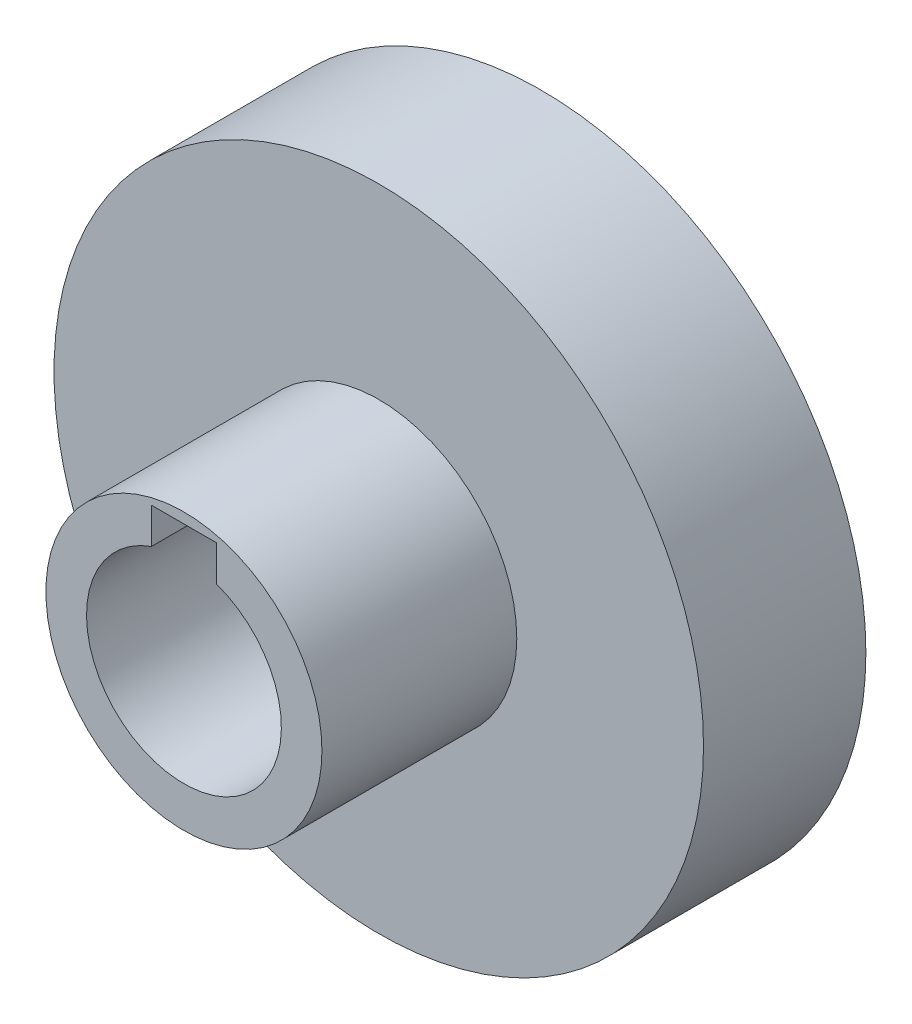
ISO-10303-21;
HEADER;
FILE_DESCRIPTION(('STEP AP214'),'2;1');
FILE_NAME('part.step','',(''),(''),'','','');
FILE_SCHEMA(('AUTOMOTIVE_DESIGN { 1 0 10303 214 1 1 1 1 }'));
ENDSEC;
DATA;
#1=APPLICATION_CONTEXT('core data for automotive mechanical design processes');
#2=APPLICATION_PROTOCOL_DEFINITION('international standard','automotive_design',2000,#1);
#3=PRODUCT_CONTEXT('',#1,'mechanical');
#4=PRODUCT('Part','Part','',(#3));
#5=PRODUCT_RELATED_PRODUCT_CATEGORY('part','',(#4));
#6=PRODUCT_DEFINITION_FORMATION('','',#4);
#7=PRODUCT_DEFINITION_CONTEXT('part definition',#1,'design');
#8=PRODUCT_DEFINITION('design','',#6,#7);
#9=PRODUCT_DEFINITION_SHAPE('','',#8);
#10=(LENGTH_UNIT() NAMED_UNIT(*) SI_UNIT(.MILLI.,.METRE.));
#11=(NAMED_UNIT(*) PLANE_ANGLE_UNIT() SI_UNIT($,.RADIAN.));
#12=(NAMED_UNIT(*) SI_UNIT($,.STERADIAN.) SOLID_ANGLE_UNIT());
#13=UNCERTAINTY_MEASURE_WITH_UNIT(LENGTH_MEASURE(1.E-05),#10,'distance_accuracy_value','');
#14=(GEOMETRIC_REPRESENTATION_CONTEXT(3) GLOBAL_UNCERTAINTY_ASSIGNED_CONTEXT((#13)) GLOBAL_UNIT_ASSIGNED_CONTEXT((#10,
#11,#12)) REPRESENTATION_CONTEXT('',''));
#15=CARTESIAN_POINT('',(0.,0.,0.));
#16=DIRECTION('',(0.,0.,1.));
#17=DIRECTION('',(1.,0.,0.));
#18=AXIS2_PLACEMENT_3D('',#15,#16,#17);
#19=CARTESIAN_POINT('',(10.,0.,5.));
#20=DIRECTION('',(0.,0.,1.));
#21=DIRECTION('',(1.,0.,0.));
#22=AXIS2_PLACEMENT_3D('',#19,#20,#21);
#23=PLANE('',#22);
#24=CARTESIAN_POINT('',(0.,0.,5.));
#25=DIRECTION('',(0.,0.,1.));
#26=DIRECTION('',(1.,0.,0.));
#27=AXIS2_PLACEMENT_3D('',#24,#25,#26);
#28=CIRCLE('',#27,10.);
#29=CARTESIAN_POINT('',(10.,0.,5.));
#30=VERTEX_POINT('',#29);
#31=EDGE_CURVE('E58',#30,#30,#28,.T.);
#32=ORIENTED_EDGE('',*,*,#31,.T.);
#33=EDGE_LOOP('',(#32));
#34=FACE_BOUND('',#33,.T.);
#35=ADVANCED_FACE('F55',(#34),#23,.T.);
#36=CARTESIAN_POINT('',(0.,0.,0.));
#37=DIRECTION('',(0.,0.,1.));
#38=DIRECTION('',(1.,0.,0.));
#39=AXIS2_PLACEMENT_3D('',#36,#37,#38);
#40=PLANE('',#39);
#41=CARTESIAN_POINT('',(0.,0.,0.));
#42=DIRECTION('',(0.,0.,1.));
#43=DIRECTION('',(1.,0.,0.));
#44=AXIS2_PLACEMENT_3D('',#41,#42,#43);
#45=CIRCLE('',#44,10.);
#46=CARTESIAN_POINT('',(10.,0.,0.));
#47=VERTEX_POINT('',#46);
#48=EDGE_CURVE('E11',#47,#47,#45,.T.);
#49=ORIENTED_EDGE('',*,*,#48,.F.);
#50=EDGE_LOOP('',(#49));
#51=FACE_BOUND('',#50,.T.);
#52=ADVANCED_FACE('F72',(#51),#40,.F.);
#53=CARTESIAN_POINT('',(0.,0.,5.));
#54=DIRECTION('',(0.,0.,-1.));
#55=DIRECTION('',(-1.,0.,0.));
#56=AXIS2_PLACEMENT_3D('',#53,#54,#55);
#57=CYLINDRICAL_SURFACE('',#56,10.);
#58=ORIENTED_EDGE('',*,*,#31,.F.);
#59=EDGE_LOOP('',(#58));
#60=FACE_BOUND('',#59,.T.);
#61=ORIENTED_EDGE('',*,*,#48,.T.);
#62=EDGE_LOOP('',(#61));
#63=FACE_BOUND('',#62,.T.);
#64=ADVANCED_FACE('F70',(#60,#63),#57,.T.);
#65=CLOSED_SHELL('',(#35,#52,#64));
#66=MANIFOLD_SOLID_BREP('B2',#65);
#67=CARTESIAN_POINT('',(10.,0.,5.));
#68=DIRECTION('',(0.,0.,1.));
#69=DIRECTION('',(1.,0.,0.));
#70=AXIS2_PLACEMENT_3D('',#67,#68,#69);
#71=PLANE('',#70);
#72=CARTESIAN_POINT('',(0.,0.,5.));
#73=DIRECTION('',(0.,0.,1.));
#74=DIRECTION('',(1.,0.,0.));
#75=AXIS2_PLACEMENT_3D('',#72,#73,#74);
#76=CIRCLE('',#75,4.25);
#77=CARTESIAN_POINT('',(4.25,0.,5.));
#78=VERTEX_POINT('',#77);
#79=EDGE_CURVE('E107',#78,#78,#76,.T.);
#80=ORIENTED_EDGE('',*,*,#79,.F.);
#81=EDGE_LOOP('',(#80));
#82=FACE_BOUND('',#81,.T.);
#83=CARTESIAN_POINT('',(0.,0.,5.));
#84=DIRECTION('',(0.,0.,1.));
#85=DIRECTION('',(1.,0.,0.));
#86=AXIS2_PLACEMENT_3D('',#83,#84,#85);
#87=CIRCLE('',#86,3.);
#88=CARTESIAN_POINT('',(1.,2.82842712474619,5.));
#89=VERTEX_POINT('',#88);
#90=CARTESIAN_POINT('',(-1.,2.82842712474619,5.));
#91=VERTEX_POINT('',#90);
#92=EDGE_CURVE('E175',#89,#91,#87,.F.);
#93=ORIENTED_EDGE('',*,*,#92,.F.);
#94=DIRECTION('',(0.,1.,0.));
#95=VECTOR('',#94,1.);
#96=CARTESIAN_POINT('',(0.999999999999999,3.92842712474619,5.));
#97=LINE('',#96,#95);
#98=CARTESIAN_POINT('',(0.999999999999999,3.92842712474619,5.));
#99=VERTEX_POINT('',#98);
#100=EDGE_CURVE('E53',#89,#99,#97,.T.);
#101=ORIENTED_EDGE('',*,*,#100,.T.);
#102=DIRECTION('',(-1.,0.,0.));
#103=VECTOR('',#102,1.);
#104=CARTESIAN_POINT('',(-1.,3.92842712474619,5.));
#105=LINE('',#104,#103);
#106=CARTESIAN_POINT('',(-1.,3.92842712474619,5.));
#107=VERTEX_POINT('',#106);
#108=EDGE_CURVE('E112',#99,#107,#105,.T.);
#109=ORIENTED_EDGE('',*,*,#108,.T.);
#110=DIRECTION('',(0.,1.,0.));
#111=VECTOR('',#110,1.);
#112=CARTESIAN_POINT('',(-1.,3.92842712474619,5.));
#113=LINE('',#112,#111);
#114=EDGE_CURVE('E126',#91,#107,#113,.T.);
#115=ORIENTED_EDGE('',*,*,#114,.F.);
#116=EDGE_LOOP('',(#93,#101,#109,#115));
#117=FACE_BOUND('',#116,.T.);
#118=ADVANCED_FACE('F104',(#82,#117),#71,.F.);
#119=CARTESIAN_POINT('',(0.,0.,-4.16532063939494));
#120=DIRECTION('',(0.,0.,1.));
#121=DIRECTION('',(1.,0.,0.));
#122=AXIS2_PLACEMENT_3D('',#119,#120,#121);
#123=CYLINDRICAL_SURFACE('',#122,3.);
#124=ORIENTED_EDGE('',*,*,#92,.T.);
#125=DIRECTION('',(0.,0.,1.));
#126=VECTOR('',#125,1.);
#127=CARTESIAN_POINT('',(-1.,2.82842712474619,-4.16532063939494));
#128=LINE('',#127,#126);
#129=CARTESIAN_POINT('',(-1.,2.82842712474619,11.));
#130=VERTEX_POINT('',#129);
#131=EDGE_CURVE('E153',#91,#130,#128,.T.);
#132=ORIENTED_EDGE('',*,*,#131,.T.);
#133=CARTESIAN_POINT('',(0.,0.,11.));
#134=DIRECTION('',(0.,0.,1.));
#135=DIRECTION('',(1.,0.,0.));
#136=AXIS2_PLACEMENT_3D('',#133,#134,#135);
#137=CIRCLE('',#136,3.);
#138=CARTESIAN_POINT('',(1.,2.82842712474619,11.));
#139=VERTEX_POINT('',#138);
#140=EDGE_CURVE('E157',#130,#139,#137,.T.);
#141=ORIENTED_EDGE('',*,*,#140,.T.);
#142=DIRECTION('',(0.,0.,1.));
#143=VECTOR('',#142,1.);
#144=CARTESIAN_POINT('',(1.,2.82842712474619,-4.16532063939494));
#145=LINE('',#144,#143);
#146=EDGE_CURVE('E144',#89,#139,#145,.T.);
#147=ORIENTED_EDGE('',*,*,#146,.F.);
#148=EDGE_LOOP('',(#124,#132,#141,#147));
#149=FACE_BOUND('',#148,.T.);
#150=ADVANCED_FACE('F158',(#149),#123,.F.);
#151=CARTESIAN_POINT('',(-1.,3.92842712474619,-4.16532063939494));
#152=DIRECTION('',(-1.,0.,0.));
#153=DIRECTION('',(0.,-1.,0.));
#154=AXIS2_PLACEMENT_3D('',#151,#152,#153);
#155=PLANE('',#154);
#156=ORIENTED_EDGE('',*,*,#114,.T.);
#157=DIRECTION('',(0.,0.,1.));
#158=VECTOR('',#157,1.);
#159=CARTESIAN_POINT('',(-1.,3.92842712474619,-4.16532063939494));
#160=LINE('',#159,#158);
#161=CARTESIAN_POINT('',(-1.,3.92842712474619,11.));
#162=VERTEX_POINT('',#161);
#163=EDGE_CURVE('E171',#107,#162,#160,.T.);
#164=ORIENTED_EDGE('',*,*,#163,.T.);
#165=DIRECTION('',(0.,-1.,0.));
#166=VECTOR('',#165,1.);
#167=CARTESIAN_POINT('',(-1.,3.92842712474619,11.));
#168=LINE('',#167,#166);
#169=EDGE_CURVE('E161',#162,#130,#168,.T.);
#170=ORIENTED_EDGE('',*,*,#169,.T.);
#171=ORIENTED_EDGE('',*,*,#131,.F.);
#172=EDGE_LOOP('',(#156,#164,#170,#171));
#173=FACE_BOUND('',#172,.T.);
#174=ADVANCED_FACE('F186',(#173),#155,.F.);
#175=CARTESIAN_POINT('',(0.,0.,11.));
#176=DIRECTION('',(0.,0.,1.));
#177=DIRECTION('',(1.,0.,0.));
#178=AXIS2_PLACEMENT_3D('',#175,#176,#177);
#179=PLANE('',#178);
#180=ORIENTED_EDGE('',*,*,#169,.F.);
#181=DIRECTION('',(1.,0.,0.));
#182=VECTOR('',#181,1.);
#183=CARTESIAN_POINT('',(-1.,3.92842712474619,11.));
#184=LINE('',#183,#182);
#185=CARTESIAN_POINT('',(0.999999999999999,3.92842712474619,11.));
#186=VERTEX_POINT('',#185);
#187=EDGE_CURVE('E166',#162,#186,#184,.T.);
#188=ORIENTED_EDGE('',*,*,#187,.T.);
#189=DIRECTION('',(0.,-1.,0.));
#190=VECTOR('',#189,1.);
#191=CARTESIAN_POINT('',(0.999999999999999,3.92842712474619,11.));
#192=LINE('',#191,#190);
#193=EDGE_CURVE('E148',#186,#139,#192,.T.);
#194=ORIENTED_EDGE('',*,*,#193,.T.);
#195=ORIENTED_EDGE('',*,*,#140,.F.);
#196=EDGE_LOOP('',(#180,#188,#194,#195));
#197=FACE_BOUND('',#196,.T.);
#198=CARTESIAN_POINT('',(0.,0.,11.));
#199=DIRECTION('',(0.,0.,1.));
#200=DIRECTION('',(1.,0.,0.));
#201=AXIS2_PLACEMENT_3D('',#198,#199,#200);
#202=CIRCLE('',#201,4.25);
#203=CARTESIAN_POINT('',(4.25,0.,11.));
#204=VERTEX_POINT('',#203);
#205=EDGE_CURVE('E176',#204,#204,#202,.T.);
#206=ORIENTED_EDGE('',*,*,#205,.T.);
#207=EDGE_LOOP('',(#206));
#208=FACE_BOUND('',#207,.T.);
#209=ADVANCED_FACE('F163',(#197,#208),#179,.T.);
#210=CARTESIAN_POINT('',(0.,0.,11.));
#211=DIRECTION('',(0.,0.,-1.));
#212=DIRECTION('',(-1.,0.,0.));
#213=AXIS2_PLACEMENT_3D('',#210,#211,#212);
#214=CYLINDRICAL_SURFACE('',#213,4.25);
#215=ORIENTED_EDGE('',*,*,#205,.F.);
#216=EDGE_LOOP('',(#215));
#217=FACE_BOUND('',#216,.T.);
#218=ORIENTED_EDGE('',*,*,#79,.T.);
#219=EDGE_LOOP('',(#218));
#220=FACE_BOUND('',#219,.T.);
#221=ADVANCED_FACE('F201',(#217,#220),#214,.T.);
#222=CARTESIAN_POINT('',(0.999999999999999,3.92842712474619,-4.16532063939494));
#223=DIRECTION('',(-1.,0.,0.));
#224=DIRECTION('',(0.,-1.,0.));
#225=AXIS2_PLACEMENT_3D('',#222,#223,#224);
#226=PLANE('',#225);
#227=ORIENTED_EDGE('',*,*,#146,.T.);
#228=ORIENTED_EDGE('',*,*,#193,.F.);
#229=DIRECTION('',(0.,0.,1.));
#230=VECTOR('',#229,1.);
#231=CARTESIAN_POINT('',(0.999999999999999,3.92842712474619,-4.16532063939494));
#232=LINE('',#231,#230);
#233=EDGE_CURVE('E152',#99,#186,#232,.T.);
#234=ORIENTED_EDGE('',*,*,#233,.F.);
#235=ORIENTED_EDGE('',*,*,#100,.F.);
#236=EDGE_LOOP('',(#227,#228,#234,#235));
#237=FACE_BOUND('',#236,.T.);
#238=ADVANCED_FACE('F146',(#237),#226,.T.);
#239=CARTESIAN_POINT('',(-1.,3.92842712474619,-4.16532063939494));
#240=DIRECTION('',(0.,-1.,0.));
#241=DIRECTION('',(0.,0.,-1.));
#242=AXIS2_PLACEMENT_3D('',#239,#240,#241);
#243=PLANE('',#242);
#244=ORIENTED_EDGE('',*,*,#233,.T.);
#245=ORIENTED_EDGE('',*,*,#187,.F.);
#246=ORIENTED_EDGE('',*,*,#163,.F.);
#247=ORIENTED_EDGE('',*,*,#108,.F.);
#248=EDGE_LOOP('',(#244,#245,#246,#247));
#249=FACE_BOUND('',#248,.T.);
#250=ADVANCED_FACE('F188',(#249),#243,.T.);
#251=CLOSED_SHELL('',(#118,#150,#174,#209,#221,#238,#250));
#252=MANIFOLD_SOLID_BREP('B6',#251);
#253=ADVANCED_BREP_SHAPE_REPRESENTATION('',(#18,#66,#252),#14);
#254=SHAPE_DEFINITION_REPRESENTATION(#9,#253);
ENDSEC;
END-ISO-10303-21;
